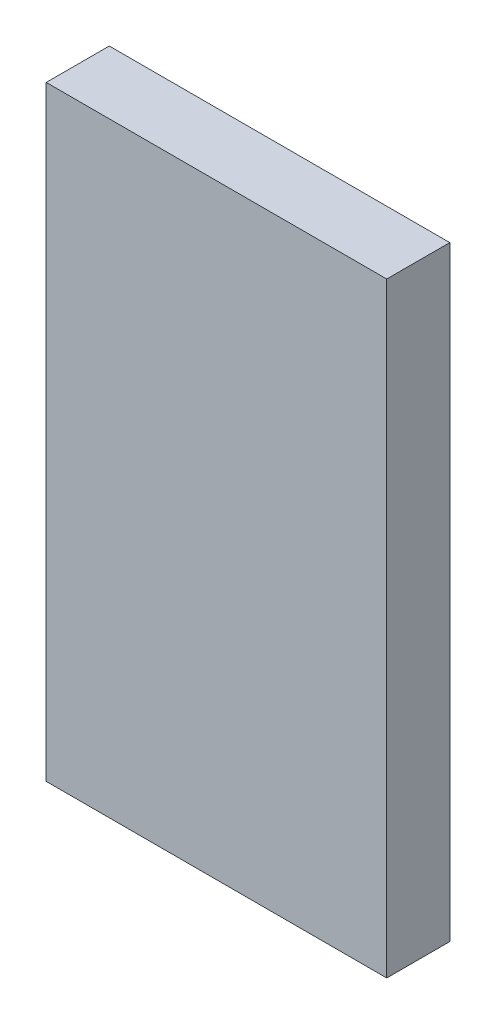
ISO-10303-21;
HEADER;
FILE_DESCRIPTION(('STEP AP214'),'2;1');
FILE_NAME('part.step','',(''),(''),'','','');
FILE_SCHEMA(('AUTOMOTIVE_DESIGN { 1 0 10303 214 1 1 1 1 }'));
ENDSEC;
DATA;
#1=APPLICATION_CONTEXT('core data for automotive mechanical design processes');
#2=APPLICATION_PROTOCOL_DEFINITION('international standard','automotive_design',2000,#1);
#3=PRODUCT_CONTEXT('',#1,'mechanical');
#4=PRODUCT('Part','Part','',(#3));
#5=PRODUCT_RELATED_PRODUCT_CATEGORY('part','',(#4));
#6=PRODUCT_DEFINITION_FORMATION('','',#4);
#7=PRODUCT_DEFINITION_CONTEXT('part definition',#1,'design');
#8=PRODUCT_DEFINITION('design','',#6,#7);
#9=PRODUCT_DEFINITION_SHAPE('','',#8);
#10=(LENGTH_UNIT() NAMED_UNIT(*) SI_UNIT(.MILLI.,.METRE.));
#11=(NAMED_UNIT(*) PLANE_ANGLE_UNIT() SI_UNIT($,.RADIAN.));
#12=(NAMED_UNIT(*) SI_UNIT($,.STERADIAN.) SOLID_ANGLE_UNIT());
#13=UNCERTAINTY_MEASURE_WITH_UNIT(LENGTH_MEASURE(1.E-05),#10,'distance_accuracy_value','');
#14=(GEOMETRIC_REPRESENTATION_CONTEXT(3) GLOBAL_UNCERTAINTY_ASSIGNED_CONTEXT((#13)) GLOBAL_UNIT_ASSIGNED_CONTEXT((#10,
#11,#12)) REPRESENTATION_CONTEXT('',''));
#15=CARTESIAN_POINT('',(0.,0.,0.));
#16=DIRECTION('',(0.,0.,1.));
#17=DIRECTION('',(1.,0.,0.));
#18=AXIS2_PLACEMENT_3D('',#15,#16,#17);
#19=CARTESIAN_POINT('',(27.,-48.,10.));
#20=DIRECTION('',(-1.,0.,0.));
#21=DIRECTION('',(0.,0.,1.));
#22=AXIS2_PLACEMENT_3D('',#19,#20,#21);
#23=PLANE('',#22);
#24=DIRECTION('',(0.,1.,0.));
#25=VECTOR('',#24,1.);
#26=CARTESIAN_POINT('',(27.,-48.,0.));
#27=LINE('',#26,#25);
#28=CARTESIAN_POINT('',(27.,-48.,0.));
#29=VERTEX_POINT('',#28);
#30=CARTESIAN_POINT('',(27.,48.,0.));
#31=VERTEX_POINT('',#30);
#32=EDGE_CURVE('E96',#29,#31,#27,.T.);
#33=ORIENTED_EDGE('',*,*,#32,.T.);
#34=DIRECTION('',(0.,0.,-1.));
#35=VECTOR('',#34,1.);
#36=CARTESIAN_POINT('',(27.,48.,10.));
#37=LINE('',#36,#35);
#38=CARTESIAN_POINT('',(27.,48.,10.));
#39=VERTEX_POINT('',#38);
#40=EDGE_CURVE('E11',#39,#31,#37,.T.);
#41=ORIENTED_EDGE('',*,*,#40,.F.);
#42=DIRECTION('',(0.,1.,0.));
#43=VECTOR('',#42,1.);
#44=CARTESIAN_POINT('',(27.,-48.,10.));
#45=LINE('',#44,#43);
#46=CARTESIAN_POINT('',(27.,-48.,10.));
#47=VERTEX_POINT('',#46);
#48=EDGE_CURVE('E84',#47,#39,#45,.T.);
#49=ORIENTED_EDGE('',*,*,#48,.F.);
#50=DIRECTION('',(0.,0.,-1.));
#51=VECTOR('',#50,1.);
#52=CARTESIAN_POINT('',(27.,-48.,10.));
#53=LINE('',#52,#51);
#54=EDGE_CURVE('E92',#47,#29,#53,.T.);
#55=ORIENTED_EDGE('',*,*,#54,.T.);
#56=EDGE_LOOP('',(#33,#41,#49,#55));
#57=FACE_BOUND('',#56,.T.);
#58=ADVANCED_FACE('F33',(#57),#23,.F.);
#59=CARTESIAN_POINT('',(-27.,48.,10.));
#60=DIRECTION('',(0.,-1.,0.));
#61=DIRECTION('',(0.,0.,-1.));
#62=AXIS2_PLACEMENT_3D('',#59,#60,#61);
#63=PLANE('',#62);
#64=DIRECTION('',(-1.,0.,0.));
#65=VECTOR('',#64,1.);
#66=CARTESIAN_POINT('',(-27.,48.,0.));
#67=LINE('',#66,#65);
#68=CARTESIAN_POINT('',(-27.,48.,0.));
#69=VERTEX_POINT('',#68);
#70=EDGE_CURVE('E88',#31,#69,#67,.T.);
#71=ORIENTED_EDGE('',*,*,#70,.T.);
#72=DIRECTION('',(0.,0.,-1.));
#73=VECTOR('',#72,1.);
#74=CARTESIAN_POINT('',(-27.,48.,10.));
#75=LINE('',#74,#73);
#76=CARTESIAN_POINT('',(-27.,48.,10.));
#77=VERTEX_POINT('',#76);
#78=EDGE_CURVE('E41',#77,#69,#75,.T.);
#79=ORIENTED_EDGE('',*,*,#78,.F.);
#80=DIRECTION('',(-1.,0.,0.));
#81=VECTOR('',#80,1.);
#82=CARTESIAN_POINT('',(-27.,48.,10.));
#83=LINE('',#82,#81);
#84=EDGE_CURVE('E79',#39,#77,#83,.T.);
#85=ORIENTED_EDGE('',*,*,#84,.F.);
#86=ORIENTED_EDGE('',*,*,#40,.T.);
#87=EDGE_LOOP('',(#71,#79,#85,#86));
#88=FACE_BOUND('',#87,.T.);
#89=ADVANCED_FACE('F87',(#88),#63,.F.);
#90=CARTESIAN_POINT('',(-27.,-48.,10.));
#91=DIRECTION('',(1.,0.,0.));
#92=DIRECTION('',(0.,0.,-1.));
#93=AXIS2_PLACEMENT_3D('',#90,#91,#92);
#94=PLANE('',#93);
#95=DIRECTION('',(0.,-1.,0.));
#96=VECTOR('',#95,1.);
#97=CARTESIAN_POINT('',(-27.,-48.,0.));
#98=LINE('',#97,#96);
#99=CARTESIAN_POINT('',(-27.,-48.,0.));
#100=VERTEX_POINT('',#99);
#101=EDGE_CURVE('E66',#69,#100,#98,.T.);
#102=ORIENTED_EDGE('',*,*,#101,.T.);
#103=DIRECTION('',(0.,0.,-1.));
#104=VECTOR('',#103,1.);
#105=CARTESIAN_POINT('',(-27.,-48.,10.));
#106=LINE('',#105,#104);
#107=CARTESIAN_POINT('',(-27.,-48.,10.));
#108=VERTEX_POINT('',#107);
#109=EDGE_CURVE('E89',#108,#100,#106,.T.);
#110=ORIENTED_EDGE('',*,*,#109,.F.);
#111=DIRECTION('',(0.,-1.,0.));
#112=VECTOR('',#111,1.);
#113=CARTESIAN_POINT('',(-27.,-48.,10.));
#114=LINE('',#113,#112);
#115=EDGE_CURVE('E82',#77,#108,#114,.T.);
#116=ORIENTED_EDGE('',*,*,#115,.F.);
#117=ORIENTED_EDGE('',*,*,#78,.T.);
#118=EDGE_LOOP('',(#102,#110,#116,#117));
#119=FACE_BOUND('',#118,.T.);
#120=ADVANCED_FACE('F90',(#119),#94,.F.);
#121=CARTESIAN_POINT('',(-27.,-48.,10.));
#122=DIRECTION('',(0.,1.,0.));
#123=DIRECTION('',(0.,0.,1.));
#124=AXIS2_PLACEMENT_3D('',#121,#122,#123);
#125=PLANE('',#124);
#126=DIRECTION('',(1.,0.,0.));
#127=VECTOR('',#126,1.);
#128=CARTESIAN_POINT('',(-27.,-48.,0.));
#129=LINE('',#128,#127);
#130=EDGE_CURVE('E72',#100,#29,#129,.T.);
#131=ORIENTED_EDGE('',*,*,#130,.T.);
#132=ORIENTED_EDGE('',*,*,#54,.F.);
#133=DIRECTION('',(1.,0.,0.));
#134=VECTOR('',#133,1.);
#135=CARTESIAN_POINT('',(-27.,-48.,10.));
#136=LINE('',#135,#134);
#137=EDGE_CURVE('E49',#108,#47,#136,.T.);
#138=ORIENTED_EDGE('',*,*,#137,.F.);
#139=ORIENTED_EDGE('',*,*,#109,.T.);
#140=EDGE_LOOP('',(#131,#132,#138,#139));
#141=FACE_BOUND('',#140,.T.);
#142=ADVANCED_FACE('F103',(#141),#125,.F.);
#143=CARTESIAN_POINT('',(0.,0.,10.));
#144=DIRECTION('',(0.,0.,-1.));
#145=DIRECTION('',(-1.,0.,0.));
#146=AXIS2_PLACEMENT_3D('',#143,#144,#145);
#147=PLANE('',#146);
#148=ORIENTED_EDGE('',*,*,#48,.T.);
#149=ORIENTED_EDGE('',*,*,#84,.T.);
#150=ORIENTED_EDGE('',*,*,#115,.T.);
#151=ORIENTED_EDGE('',*,*,#137,.T.);
#152=EDGE_LOOP('',(#148,#149,#150,#151));
#153=FACE_BOUND('',#152,.T.);
#154=ADVANCED_FACE('F80',(#153),#147,.F.);
#155=CARTESIAN_POINT('',(0.,0.,0.));
#156=DIRECTION('',(0.,0.,-1.));
#157=DIRECTION('',(-1.,0.,0.));
#158=AXIS2_PLACEMENT_3D('',#155,#156,#157);
#159=PLANE('',#158);
#160=ORIENTED_EDGE('',*,*,#32,.F.);
#161=ORIENTED_EDGE('',*,*,#130,.F.);
#162=ORIENTED_EDGE('',*,*,#101,.F.);
#163=ORIENTED_EDGE('',*,*,#70,.F.);
#164=EDGE_LOOP('',(#160,#161,#162,#163));
#165=FACE_BOUND('',#164,.T.);
#166=ADVANCED_FACE('F106',(#165),#159,.T.);
#167=CLOSED_SHELL('',(#58,#89,#120,#142,#154,#166));
#168=MANIFOLD_SOLID_BREP('B2',#167);
#169=ADVANCED_BREP_SHAPE_REPRESENTATION('',(#18,#168),#14);
#170=SHAPE_DEFINITION_REPRESENTATION(#9,#169);
ENDSEC;
END-ISO-10303-21;
